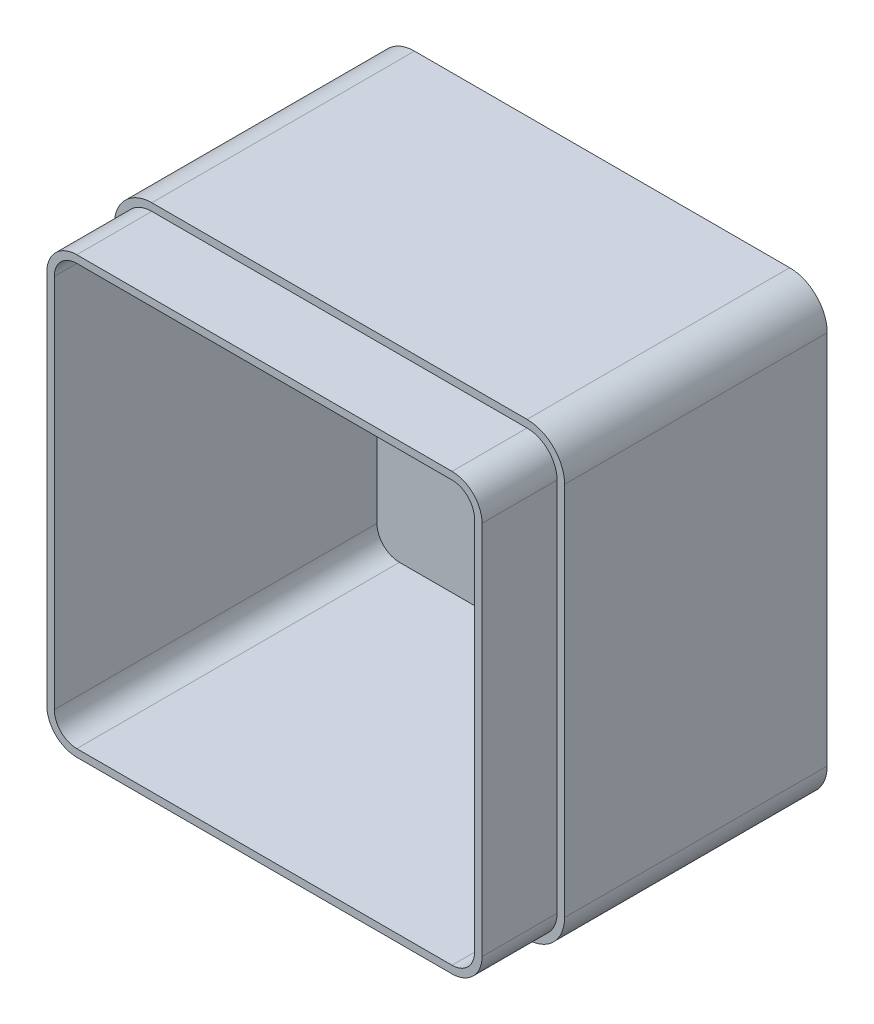
ISO-10303-21;
HEADER;
FILE_DESCRIPTION(('STEP AP214'),'2;1');
FILE_NAME('part.step','',(''),(''),'','','');
FILE_SCHEMA(('AUTOMOTIVE_DESIGN { 1 0 10303 214 1 1 1 1 }'));
ENDSEC;
DATA;
#1=APPLICATION_CONTEXT('core data for automotive mechanical design processes');
#2=APPLICATION_PROTOCOL_DEFINITION('international standard','automotive_design',2000,#1);
#3=PRODUCT_CONTEXT('',#1,'mechanical');
#4=PRODUCT('Part','Part','',(#3));
#5=PRODUCT_RELATED_PRODUCT_CATEGORY('part','',(#4));
#6=PRODUCT_DEFINITION_FORMATION('','',#4);
#7=PRODUCT_DEFINITION_CONTEXT('part definition',#1,'design');
#8=PRODUCT_DEFINITION('design','',#6,#7);
#9=PRODUCT_DEFINITION_SHAPE('','',#8);
#10=(LENGTH_UNIT() NAMED_UNIT(*) SI_UNIT(.MILLI.,.METRE.));
#11=(NAMED_UNIT(*) PLANE_ANGLE_UNIT() SI_UNIT($,.RADIAN.));
#12=(NAMED_UNIT(*) SI_UNIT($,.STERADIAN.) SOLID_ANGLE_UNIT());
#13=UNCERTAINTY_MEASURE_WITH_UNIT(LENGTH_MEASURE(1.E-05),#10,'distance_accuracy_value','');
#14=(GEOMETRIC_REPRESENTATION_CONTEXT(3) GLOBAL_UNCERTAINTY_ASSIGNED_CONTEXT((#13)) GLOBAL_UNIT_ASSIGNED_CONTEXT((#10,
#11,#12)) REPRESENTATION_CONTEXT('',''));
#15=CARTESIAN_POINT('',(0.,0.,0.));
#16=DIRECTION('',(0.,0.,1.));
#17=DIRECTION('',(1.,0.,0.));
#18=AXIS2_PLACEMENT_3D('',#15,#16,#17);
#19=CARTESIAN_POINT('',(0.,0.,90.));
#20=DIRECTION('',(0.,0.,1.));
#21=DIRECTION('',(1.,0.,0.));
#22=AXIS2_PLACEMENT_3D('',#19,#20,#21);
#23=PLANE('',#22);
#24=DIRECTION('',(1.,0.,0.));
#25=VECTOR('',#24,1.);
#26=CARTESIAN_POINT('',(0.,4.,90.));
#27=LINE('',#26,#25);
#28=CARTESIAN_POINT('',(9.99999999999999,4.,90.));
#29=VERTEX_POINT('',#28);
#30=CARTESIAN_POINT('',(110.,4.,90.));
#31=VERTEX_POINT('',#30);
#32=EDGE_CURVE('E392',#29,#31,#27,.T.);
#33=ORIENTED_EDGE('',*,*,#32,.F.);
#34=CARTESIAN_POINT('',(9.99999999999999,10.,90.));
#35=DIRECTION('',(0.,0.,1.));
#36=DIRECTION('',(1.,0.,0.));
#37=AXIS2_PLACEMENT_3D('',#34,#35,#36);
#38=CIRCLE('',#37,6.);
#39=CARTESIAN_POINT('',(4.,10.,90.));
#40=VERTEX_POINT('',#39);
#41=EDGE_CURVE('E393',#40,#29,#38,.T.);
#42=ORIENTED_EDGE('',*,*,#41,.F.);
#43=DIRECTION('',(0.,1.,0.));
#44=VECTOR('',#43,1.);
#45=CARTESIAN_POINT('',(4.,0.,90.));
#46=LINE('',#45,#44);
#47=CARTESIAN_POINT('',(3.99999999999996,110.,90.));
#48=VERTEX_POINT('',#47);
#49=EDGE_CURVE('E381',#40,#48,#46,.T.);
#50=ORIENTED_EDGE('',*,*,#49,.T.);
#51=CARTESIAN_POINT('',(9.99999999999996,110.,90.));
#52=DIRECTION('',(0.,0.,1.));
#53=DIRECTION('',(1.,0.,0.));
#54=AXIS2_PLACEMENT_3D('',#51,#52,#53);
#55=CIRCLE('',#54,6.);
#56=CARTESIAN_POINT('',(9.99999999999996,116.,90.));
#57=VERTEX_POINT('',#56);
#58=EDGE_CURVE('E374',#57,#48,#55,.T.);
#59=ORIENTED_EDGE('',*,*,#58,.F.);
#60=DIRECTION('',(1.,0.,0.));
#61=VECTOR('',#60,1.);
#62=CARTESIAN_POINT('',(0.,116.,90.));
#63=LINE('',#62,#61);
#64=CARTESIAN_POINT('',(110.,116.,90.));
#65=VERTEX_POINT('',#64);
#66=EDGE_CURVE('E353',#57,#65,#63,.T.);
#67=ORIENTED_EDGE('',*,*,#66,.T.);
#68=CARTESIAN_POINT('',(110.,110.,90.));
#69=DIRECTION('',(0.,0.,1.));
#70=DIRECTION('',(1.,0.,0.));
#71=AXIS2_PLACEMENT_3D('',#68,#69,#70);
#72=CIRCLE('',#71,6.);
#73=CARTESIAN_POINT('',(116.,110.,90.));
#74=VERTEX_POINT('',#73);
#75=EDGE_CURVE('E388',#74,#65,#72,.T.);
#76=ORIENTED_EDGE('',*,*,#75,.F.);
#77=DIRECTION('',(0.,1.,0.));
#78=VECTOR('',#77,1.);
#79=CARTESIAN_POINT('',(116.,0.,90.));
#80=LINE('',#79,#78);
#81=CARTESIAN_POINT('',(116.,10.,90.));
#82=VERTEX_POINT('',#81);
#83=EDGE_CURVE('E385',#82,#74,#80,.T.);
#84=ORIENTED_EDGE('',*,*,#83,.F.);
#85=CARTESIAN_POINT('',(110.,10.,90.));
#86=DIRECTION('',(0.,0.,1.));
#87=DIRECTION('',(1.,0.,0.));
#88=AXIS2_PLACEMENT_3D('',#85,#86,#87);
#89=CIRCLE('',#88,6.);
#90=EDGE_CURVE('E367',#31,#82,#89,.T.);
#91=ORIENTED_EDGE('',*,*,#90,.F.);
#92=EDGE_LOOP('',(#33,#42,#50,#59,#67,#76,#84,#91));
#93=FACE_BOUND('',#92,.T.);
#94=DIRECTION('',(0.,1.,0.));
#95=VECTOR('',#94,1.);
#96=CARTESIAN_POINT('',(118.,9.99999999999999,90.));
#97=LINE('',#96,#95);
#98=CARTESIAN_POINT('',(118.,10.,90.));
#99=VERTEX_POINT('',#98);
#100=CARTESIAN_POINT('',(118.,110.,90.));
#101=VERTEX_POINT('',#100);
#102=EDGE_CURVE('E229',#99,#101,#97,.T.);
#103=ORIENTED_EDGE('',*,*,#102,.T.);
#104=CARTESIAN_POINT('',(110.,110.,90.));
#105=DIRECTION('',(0.,0.,1.));
#106=DIRECTION('',(1.,0.,0.));
#107=AXIS2_PLACEMENT_3D('',#104,#105,#106);
#108=CIRCLE('',#107,8.00000000000001);
#109=CARTESIAN_POINT('',(110.,118.,90.));
#110=VERTEX_POINT('',#109);
#111=EDGE_CURVE('E256',#101,#110,#108,.T.);
#112=ORIENTED_EDGE('',*,*,#111,.T.);
#113=DIRECTION('',(-1.,0.,0.));
#114=VECTOR('',#113,1.);
#115=CARTESIAN_POINT('',(110.,118.,90.));
#116=LINE('',#115,#114);
#117=CARTESIAN_POINT('',(9.99999999999995,118.,90.));
#118=VERTEX_POINT('',#117);
#119=EDGE_CURVE('E206',#110,#118,#116,.T.);
#120=ORIENTED_EDGE('',*,*,#119,.T.);
#121=CARTESIAN_POINT('',(9.99999999999996,110.,90.));
#122=DIRECTION('',(0.,0.,1.));
#123=DIRECTION('',(1.,0.,0.));
#124=AXIS2_PLACEMENT_3D('',#121,#122,#123);
#125=CIRCLE('',#124,7.99999999999999);
#126=CARTESIAN_POINT('',(1.99999999999997,110.,90.));
#127=VERTEX_POINT('',#126);
#128=EDGE_CURVE('E55',#118,#127,#125,.T.);
#129=ORIENTED_EDGE('',*,*,#128,.T.);
#130=DIRECTION('',(0.,-1.,0.));
#131=VECTOR('',#130,1.);
#132=CARTESIAN_POINT('',(1.99999999999996,110.,90.));
#133=LINE('',#132,#131);
#134=CARTESIAN_POINT('',(1.99999999999996,9.99999999999999,90.));
#135=VERTEX_POINT('',#134);
#136=EDGE_CURVE('E263',#127,#135,#133,.T.);
#137=ORIENTED_EDGE('',*,*,#136,.T.);
#138=CARTESIAN_POINT('',(9.99999999999999,10.,90.));
#139=DIRECTION('',(0.,0.,1.));
#140=DIRECTION('',(1.,0.,0.));
#141=AXIS2_PLACEMENT_3D('',#138,#139,#140);
#142=CIRCLE('',#141,8.00000000000001);
#143=CARTESIAN_POINT('',(9.99999999999999,1.99999999999998,90.));
#144=VERTEX_POINT('',#143);
#145=EDGE_CURVE('E267',#135,#144,#142,.T.);
#146=ORIENTED_EDGE('',*,*,#145,.T.);
#147=DIRECTION('',(1.,0.,0.));
#148=VECTOR('',#147,1.);
#149=CARTESIAN_POINT('',(9.99999999999999,2.,90.));
#150=LINE('',#149,#148);
#151=CARTESIAN_POINT('',(110.,2.,90.));
#152=VERTEX_POINT('',#151);
#153=EDGE_CURVE('E271',#144,#152,#150,.T.);
#154=ORIENTED_EDGE('',*,*,#153,.T.);
#155=CARTESIAN_POINT('',(110.,10.,90.));
#156=DIRECTION('',(0.,0.,1.));
#157=DIRECTION('',(1.,0.,0.));
#158=AXIS2_PLACEMENT_3D('',#155,#156,#157);
#159=CIRCLE('',#158,7.99999999999999);
#160=EDGE_CURVE('E233',#152,#99,#159,.T.);
#161=ORIENTED_EDGE('',*,*,#160,.T.);
#162=EDGE_LOOP('',(#103,#112,#120,#129,#137,#146,#154,#161));
#163=FACE_BOUND('',#162,.T.);
#164=ADVANCED_FACE('F39',(#93,#163),#23,.T.);
#165=CARTESIAN_POINT('',(0.,116.,90.));
#166=DIRECTION('',(0.,1.,0.));
#167=DIRECTION('',(0.,0.,1.));
#168=AXIS2_PLACEMENT_3D('',#165,#166,#167);
#169=PLANE('',#168);
#170=ORIENTED_EDGE('',*,*,#66,.F.);
#171=DIRECTION('',(0.,0.,1.));
#172=VECTOR('',#171,1.);
#173=CARTESIAN_POINT('',(9.99999999999996,116.,90.));
#174=LINE('',#173,#172);
#175=CARTESIAN_POINT('',(9.99999999999996,116.,4.));
#176=VERTEX_POINT('',#175);
#177=EDGE_CURVE('E326',#176,#57,#174,.T.);
#178=ORIENTED_EDGE('',*,*,#177,.F.);
#179=DIRECTION('',(1.,0.,0.));
#180=VECTOR('',#179,1.);
#181=CARTESIAN_POINT('',(0.,116.,4.));
#182=LINE('',#181,#180);
#183=CARTESIAN_POINT('',(110.,116.,4.));
#184=VERTEX_POINT('',#183);
#185=EDGE_CURVE('E320',#176,#184,#182,.T.);
#186=ORIENTED_EDGE('',*,*,#185,.T.);
#187=DIRECTION('',(0.,0.,1.));
#188=VECTOR('',#187,1.);
#189=CARTESIAN_POINT('',(110.,116.,90.));
#190=LINE('',#189,#188);
#191=EDGE_CURVE('E321',#65,#184,#190,.F.);
#192=ORIENTED_EDGE('',*,*,#191,.F.);
#193=EDGE_LOOP('',(#170,#178,#186,#192));
#194=FACE_BOUND('',#193,.T.);
#195=ADVANCED_FACE('F505',(#194),#169,.F.);
#196=CARTESIAN_POINT('',(4.,0.,90.));
#197=DIRECTION('',(-1.,0.,0.));
#198=DIRECTION('',(0.,-1.,0.));
#199=AXIS2_PLACEMENT_3D('',#196,#197,#198);
#200=PLANE('',#199);
#201=DIRECTION('',(0.,1.,0.));
#202=VECTOR('',#201,1.);
#203=CARTESIAN_POINT('',(4.,0.,4.));
#204=LINE('',#203,#202);
#205=CARTESIAN_POINT('',(4.,10.,4.));
#206=VERTEX_POINT('',#205);
#207=CARTESIAN_POINT('',(3.99999999999996,110.,4.));
#208=VERTEX_POINT('',#207);
#209=EDGE_CURVE('E346',#206,#208,#204,.T.);
#210=ORIENTED_EDGE('',*,*,#209,.T.);
#211=DIRECTION('',(0.,0.,1.));
#212=VECTOR('',#211,1.);
#213=CARTESIAN_POINT('',(3.99999999999996,110.,90.));
#214=LINE('',#213,#212);
#215=EDGE_CURVE('E363',#48,#208,#214,.F.);
#216=ORIENTED_EDGE('',*,*,#215,.F.);
#217=ORIENTED_EDGE('',*,*,#49,.F.);
#218=DIRECTION('',(0.,0.,1.));
#219=VECTOR('',#218,1.);
#220=CARTESIAN_POINT('',(4.,10.,90.));
#221=LINE('',#220,#219);
#222=EDGE_CURVE('E333',#206,#40,#221,.T.);
#223=ORIENTED_EDGE('',*,*,#222,.F.);
#224=EDGE_LOOP('',(#210,#216,#217,#223));
#225=FACE_BOUND('',#224,.T.);
#226=ADVANCED_FACE('F510',(#225),#200,.F.);
#227=CARTESIAN_POINT('',(0.,4.,90.));
#228=DIRECTION('',(0.,1.,0.));
#229=DIRECTION('',(0.,0.,1.));
#230=AXIS2_PLACEMENT_3D('',#227,#228,#229);
#231=PLANE('',#230);
#232=DIRECTION('',(1.,0.,0.));
#233=VECTOR('',#232,1.);
#234=CARTESIAN_POINT('',(0.,4.,4.));
#235=LINE('',#234,#233);
#236=CARTESIAN_POINT('',(9.99999999999999,4.,4.));
#237=VERTEX_POINT('',#236);
#238=CARTESIAN_POINT('',(110.,4.,4.));
#239=VERTEX_POINT('',#238);
#240=EDGE_CURVE('E337',#237,#239,#235,.T.);
#241=ORIENTED_EDGE('',*,*,#240,.F.);
#242=DIRECTION('',(0.,0.,1.));
#243=VECTOR('',#242,1.);
#244=CARTESIAN_POINT('',(9.99999999999999,4.,90.));
#245=LINE('',#244,#243);
#246=EDGE_CURVE('E341',#29,#237,#245,.F.);
#247=ORIENTED_EDGE('',*,*,#246,.F.);
#248=ORIENTED_EDGE('',*,*,#32,.T.);
#249=DIRECTION('',(0.,0.,1.));
#250=VECTOR('',#249,1.);
#251=CARTESIAN_POINT('',(110.,4.,90.));
#252=LINE('',#251,#250);
#253=EDGE_CURVE('E371',#239,#31,#252,.T.);
#254=ORIENTED_EDGE('',*,*,#253,.F.);
#255=EDGE_LOOP('',(#241,#247,#248,#254));
#256=FACE_BOUND('',#255,.T.);
#257=ADVANCED_FACE('F539',(#256),#231,.T.);
#258=CARTESIAN_POINT('',(116.,0.,90.));
#259=DIRECTION('',(-1.,0.,0.));
#260=DIRECTION('',(0.,-1.,0.));
#261=AXIS2_PLACEMENT_3D('',#258,#259,#260);
#262=PLANE('',#261);
#263=ORIENTED_EDGE('',*,*,#83,.T.);
#264=DIRECTION('',(0.,0.,1.));
#265=VECTOR('',#264,1.);
#266=CARTESIAN_POINT('',(116.,110.,90.));
#267=LINE('',#266,#265);
#268=CARTESIAN_POINT('',(116.,110.,4.));
#269=VERTEX_POINT('',#268);
#270=EDGE_CURVE('E378',#269,#74,#267,.T.);
#271=ORIENTED_EDGE('',*,*,#270,.F.);
#272=DIRECTION('',(0.,1.,0.));
#273=VECTOR('',#272,1.);
#274=CARTESIAN_POINT('',(116.,0.,4.));
#275=LINE('',#274,#273);
#276=CARTESIAN_POINT('',(116.,10.,4.));
#277=VERTEX_POINT('',#276);
#278=EDGE_CURVE('E330',#277,#269,#275,.T.);
#279=ORIENTED_EDGE('',*,*,#278,.F.);
#280=DIRECTION('',(0.,0.,1.));
#281=VECTOR('',#280,1.);
#282=CARTESIAN_POINT('',(116.,10.,90.));
#283=LINE('',#282,#281);
#284=EDGE_CURVE('E357',#82,#277,#283,.F.);
#285=ORIENTED_EDGE('',*,*,#284,.F.);
#286=EDGE_LOOP('',(#263,#271,#279,#285));
#287=FACE_BOUND('',#286,.T.);
#288=ADVANCED_FACE('F535',(#287),#262,.T.);
#289=CARTESIAN_POINT('',(0.,0.,4.));
#290=DIRECTION('',(0.,0.,1.));
#291=DIRECTION('',(1.,0.,0.));
#292=AXIS2_PLACEMENT_3D('',#289,#290,#291);
#293=PLANE('',#292);
#294=ORIENTED_EDGE('',*,*,#278,.T.);
#295=CARTESIAN_POINT('',(110.,110.,4.));
#296=DIRECTION('',(0.,0.,1.));
#297=DIRECTION('',(1.,0.,0.));
#298=AXIS2_PLACEMENT_3D('',#295,#296,#297);
#299=CIRCLE('',#298,6.);
#300=EDGE_CURVE('E349',#184,#269,#299,.F.);
#301=ORIENTED_EDGE('',*,*,#300,.F.);
#302=ORIENTED_EDGE('',*,*,#185,.F.);
#303=CARTESIAN_POINT('',(9.99999999999996,110.,4.));
#304=DIRECTION('',(0.,0.,1.));
#305=DIRECTION('',(1.,0.,0.));
#306=AXIS2_PLACEMENT_3D('',#303,#304,#305);
#307=CIRCLE('',#306,6.);
#308=EDGE_CURVE('E354',#208,#176,#307,.F.);
#309=ORIENTED_EDGE('',*,*,#308,.F.);
#310=ORIENTED_EDGE('',*,*,#209,.F.);
#311=CARTESIAN_POINT('',(9.99999999999999,10.,4.));
#312=DIRECTION('',(0.,0.,1.));
#313=DIRECTION('',(1.,0.,0.));
#314=AXIS2_PLACEMENT_3D('',#311,#312,#313);
#315=CIRCLE('',#314,6.);
#316=EDGE_CURVE('E342',#237,#206,#315,.F.);
#317=ORIENTED_EDGE('',*,*,#316,.F.);
#318=ORIENTED_EDGE('',*,*,#240,.T.);
#319=CARTESIAN_POINT('',(110.,10.,4.));
#320=DIRECTION('',(0.,0.,1.));
#321=DIRECTION('',(1.,0.,0.));
#322=AXIS2_PLACEMENT_3D('',#319,#320,#321);
#323=CIRCLE('',#322,6.);
#324=EDGE_CURVE('E338',#277,#239,#323,.F.);
#325=ORIENTED_EDGE('',*,*,#324,.F.);
#326=EDGE_LOOP('',(#294,#301,#302,#309,#310,#317,#318,#325));
#327=FACE_BOUND('',#326,.T.);
#328=ADVANCED_FACE('F531',(#327),#293,.T.);
#329=CARTESIAN_POINT('',(110.,10.,90.));
#330=DIRECTION('',(0.,0.,-1.));
#331=DIRECTION('',(-1.,0.,0.));
#332=AXIS2_PLACEMENT_3D('',#329,#330,#331);
#333=CYLINDRICAL_SURFACE('',#332,6.);
#334=ORIENTED_EDGE('',*,*,#90,.T.);
#335=ORIENTED_EDGE('',*,*,#284,.T.);
#336=ORIENTED_EDGE('',*,*,#324,.T.);
#337=ORIENTED_EDGE('',*,*,#253,.T.);
#338=EDGE_LOOP('',(#334,#335,#336,#337));
#339=FACE_BOUND('',#338,.T.);
#340=ADVANCED_FACE('F527',(#339),#333,.F.);
#341=CARTESIAN_POINT('',(9.99999999999999,10.,90.));
#342=DIRECTION('',(0.,0.,1.));
#343=DIRECTION('',(1.,0.,0.));
#344=AXIS2_PLACEMENT_3D('',#341,#342,#343);
#345=CYLINDRICAL_SURFACE('',#344,6.);
#346=ORIENTED_EDGE('',*,*,#41,.T.);
#347=ORIENTED_EDGE('',*,*,#246,.T.);
#348=ORIENTED_EDGE('',*,*,#316,.T.);
#349=ORIENTED_EDGE('',*,*,#222,.T.);
#350=EDGE_LOOP('',(#346,#347,#348,#349));
#351=FACE_BOUND('',#350,.T.);
#352=ADVANCED_FACE('F523',(#351),#345,.F.);
#353=CARTESIAN_POINT('',(110.,110.,90.));
#354=DIRECTION('',(0.,0.,1.));
#355=DIRECTION('',(1.,0.,0.));
#356=AXIS2_PLACEMENT_3D('',#353,#354,#355);
#357=CYLINDRICAL_SURFACE('',#356,6.);
#358=ORIENTED_EDGE('',*,*,#75,.T.);
#359=ORIENTED_EDGE('',*,*,#191,.T.);
#360=ORIENTED_EDGE('',*,*,#300,.T.);
#361=ORIENTED_EDGE('',*,*,#270,.T.);
#362=EDGE_LOOP('',(#358,#359,#360,#361));
#363=FACE_BOUND('',#362,.T.);
#364=ADVANCED_FACE('F519',(#363),#357,.F.);
#365=CARTESIAN_POINT('',(9.99999999999996,110.,90.));
#366=DIRECTION('',(0.,0.,-1.));
#367=DIRECTION('',(-1.,0.,0.));
#368=AXIS2_PLACEMENT_3D('',#365,#366,#367);
#369=CYLINDRICAL_SURFACE('',#368,6.);
#370=ORIENTED_EDGE('',*,*,#58,.T.);
#371=ORIENTED_EDGE('',*,*,#215,.T.);
#372=ORIENTED_EDGE('',*,*,#308,.T.);
#373=ORIENTED_EDGE('',*,*,#177,.T.);
#374=EDGE_LOOP('',(#370,#371,#372,#373));
#375=FACE_BOUND('',#374,.T.);
#376=ADVANCED_FACE('F516',(#375),#369,.F.);
#377=CARTESIAN_POINT('',(9.99999999999999,10.,70.));
#378=DIRECTION('',(0.,0.,1.));
#379=DIRECTION('',(1.,0.,0.));
#380=AXIS2_PLACEMENT_3D('',#377,#378,#379);
#381=PLANE('',#380);
#382=DIRECTION('',(0.,1.,0.));
#383=VECTOR('',#382,1.);
#384=CARTESIAN_POINT('',(118.,9.99999999999999,70.));
#385=LINE('',#384,#383);
#386=CARTESIAN_POINT('',(118.,10.,70.));
#387=VERTEX_POINT('',#386);
#388=CARTESIAN_POINT('',(118.,110.,70.));
#389=VERTEX_POINT('',#388);
#390=EDGE_CURVE('E213',#387,#389,#385,.T.);
#391=ORIENTED_EDGE('',*,*,#390,.F.);
#392=CARTESIAN_POINT('',(110.,10.,70.));
#393=DIRECTION('',(0.,0.,1.));
#394=DIRECTION('',(1.,0.,0.));
#395=AXIS2_PLACEMENT_3D('',#392,#393,#394);
#396=CIRCLE('',#395,7.99999999999999);
#397=CARTESIAN_POINT('',(110.,2.,70.));
#398=VERTEX_POINT('',#397);
#399=EDGE_CURVE('E250',#398,#387,#396,.T.);
#400=ORIENTED_EDGE('',*,*,#399,.F.);
#401=DIRECTION('',(1.,0.,0.));
#402=VECTOR('',#401,1.);
#403=CARTESIAN_POINT('',(9.99999999999999,2.,70.));
#404=LINE('',#403,#402);
#405=CARTESIAN_POINT('',(9.99999999999999,1.99999999999998,70.));
#406=VERTEX_POINT('',#405);
#407=EDGE_CURVE('E246',#406,#398,#404,.T.);
#408=ORIENTED_EDGE('',*,*,#407,.F.);
#409=CARTESIAN_POINT('',(9.99999999999999,10.,70.));
#410=DIRECTION('',(0.,0.,1.));
#411=DIRECTION('',(1.,0.,0.));
#412=AXIS2_PLACEMENT_3D('',#409,#410,#411);
#413=CIRCLE('',#412,8.00000000000001);
#414=CARTESIAN_POINT('',(1.99999999999996,9.99999999999999,70.));
#415=VERTEX_POINT('',#414);
#416=EDGE_CURVE('E242',#415,#406,#413,.T.);
#417=ORIENTED_EDGE('',*,*,#416,.F.);
#418=DIRECTION('',(0.,-1.,0.));
#419=VECTOR('',#418,1.);
#420=CARTESIAN_POINT('',(1.99999999999996,110.,70.));
#421=LINE('',#420,#419);
#422=CARTESIAN_POINT('',(1.99999999999997,110.,70.));
#423=VERTEX_POINT('',#422);
#424=EDGE_CURVE('E238',#423,#415,#421,.T.);
#425=ORIENTED_EDGE('',*,*,#424,.F.);
#426=CARTESIAN_POINT('',(9.99999999999996,110.,70.));
#427=DIRECTION('',(0.,0.,1.));
#428=DIRECTION('',(1.,0.,0.));
#429=AXIS2_PLACEMENT_3D('',#426,#427,#428);
#430=CIRCLE('',#429,7.99999999999999);
#431=CARTESIAN_POINT('',(9.99999999999995,118.,70.));
#432=VERTEX_POINT('',#431);
#433=EDGE_CURVE('E223',#432,#423,#430,.T.);
#434=ORIENTED_EDGE('',*,*,#433,.F.);
#435=DIRECTION('',(-1.,0.,0.));
#436=VECTOR('',#435,1.);
#437=CARTESIAN_POINT('',(110.,118.,70.));
#438=LINE('',#437,#436);
#439=CARTESIAN_POINT('',(110.,118.,70.));
#440=VERTEX_POINT('',#439);
#441=EDGE_CURVE('E204',#440,#432,#438,.T.);
#442=ORIENTED_EDGE('',*,*,#441,.F.);
#443=CARTESIAN_POINT('',(110.,110.,70.));
#444=DIRECTION('',(0.,0.,1.));
#445=DIRECTION('',(1.,0.,0.));
#446=AXIS2_PLACEMENT_3D('',#443,#444,#445);
#447=CIRCLE('',#446,8.00000000000001);
#448=EDGE_CURVE('E219',#389,#440,#447,.T.);
#449=ORIENTED_EDGE('',*,*,#448,.F.);
#450=EDGE_LOOP('',(#391,#400,#408,#417,#425,#434,#442,#449));
#451=FACE_BOUND('',#450,.T.);
#452=CARTESIAN_POINT('',(9.99999999999999,10.,70.));
#453=DIRECTION('',(0.,0.,1.));
#454=DIRECTION('',(1.,0.,0.));
#455=AXIS2_PLACEMENT_3D('',#452,#453,#454);
#456=CIRCLE('',#455,10.);
#457=CARTESIAN_POINT('',(0.,9.99999999999999,70.));
#458=VERTEX_POINT('',#457);
#459=CARTESIAN_POINT('',(9.99999999999999,0.,70.));
#460=VERTEX_POINT('',#459);
#461=EDGE_CURVE('E280',#458,#460,#456,.T.);
#462=ORIENTED_EDGE('',*,*,#461,.T.);
#463=DIRECTION('',(1.,0.,0.));
#464=VECTOR('',#463,1.);
#465=CARTESIAN_POINT('',(9.99999999999999,0.,70.));
#466=LINE('',#465,#464);
#467=CARTESIAN_POINT('',(110.,0.,70.));
#468=VERTEX_POINT('',#467);
#469=EDGE_CURVE('E300',#460,#468,#466,.T.);
#470=ORIENTED_EDGE('',*,*,#469,.T.);
#471=CARTESIAN_POINT('',(110.,10.,70.));
#472=DIRECTION('',(0.,0.,1.));
#473=DIRECTION('',(1.,0.,0.));
#474=AXIS2_PLACEMENT_3D('',#471,#472,#473);
#475=CIRCLE('',#474,9.99999999999999);
#476=CARTESIAN_POINT('',(120.,10.,70.));
#477=VERTEX_POINT('',#476);
#478=EDGE_CURVE('E303',#468,#477,#475,.T.);
#479=ORIENTED_EDGE('',*,*,#478,.T.);
#480=DIRECTION('',(0.,1.,0.));
#481=VECTOR('',#480,1.);
#482=CARTESIAN_POINT('',(120.,10.,70.));
#483=LINE('',#482,#481);
#484=CARTESIAN_POINT('',(120.,110.,70.));
#485=VERTEX_POINT('',#484);
#486=EDGE_CURVE('E306',#477,#485,#483,.T.);
#487=ORIENTED_EDGE('',*,*,#486,.T.);
#488=CARTESIAN_POINT('',(110.,110.,70.));
#489=DIRECTION('',(0.,0.,1.));
#490=DIRECTION('',(1.,0.,0.));
#491=AXIS2_PLACEMENT_3D('',#488,#489,#490);
#492=CIRCLE('',#491,9.99999999999999);
#493=CARTESIAN_POINT('',(110.,120.,70.));
#494=VERTEX_POINT('',#493);
#495=EDGE_CURVE('E309',#485,#494,#492,.T.);
#496=ORIENTED_EDGE('',*,*,#495,.T.);
#497=DIRECTION('',(-1.,0.,0.));
#498=VECTOR('',#497,1.);
#499=CARTESIAN_POINT('',(110.,120.,70.));
#500=LINE('',#499,#498);
#501=CARTESIAN_POINT('',(9.99999999999996,120.,70.));
#502=VERTEX_POINT('',#501);
#503=EDGE_CURVE('E63',#494,#502,#500,.T.);
#504=ORIENTED_EDGE('',*,*,#503,.T.);
#505=CARTESIAN_POINT('',(9.99999999999996,110.,70.));
#506=DIRECTION('',(0.,0.,1.));
#507=DIRECTION('',(1.,0.,0.));
#508=AXIS2_PLACEMENT_3D('',#505,#506,#507);
#509=CIRCLE('',#508,9.99999999999999);
#510=CARTESIAN_POINT('',(0.,110.,70.));
#511=VERTEX_POINT('',#510);
#512=EDGE_CURVE('E314',#502,#511,#509,.T.);
#513=ORIENTED_EDGE('',*,*,#512,.T.);
#514=DIRECTION('',(0.,-1.,0.));
#515=VECTOR('',#514,1.);
#516=CARTESIAN_POINT('',(0.,110.,70.));
#517=LINE('',#516,#515);
#518=EDGE_CURVE('E317',#511,#458,#517,.T.);
#519=ORIENTED_EDGE('',*,*,#518,.T.);
#520=EDGE_LOOP('',(#462,#470,#479,#487,#496,#504,#513,#519));
#521=FACE_BOUND('',#520,.T.);
#522=ADVANCED_FACE('F218',(#451,#521),#381,.T.);
#523=CARTESIAN_POINT('',(110.,110.,70.));
#524=DIRECTION('',(0.,0.,1.));
#525=DIRECTION('',(1.,0.,0.));
#526=AXIS2_PLACEMENT_3D('',#523,#524,#525);
#527=CYLINDRICAL_SURFACE('',#526,8.00000000000001);
#528=ORIENTED_EDGE('',*,*,#111,.F.);
#529=DIRECTION('',(0.,0.,1.));
#530=VECTOR('',#529,1.);
#531=CARTESIAN_POINT('',(118.,110.,70.));
#532=LINE('',#531,#530);
#533=EDGE_CURVE('E227',#389,#101,#532,.T.);
#534=ORIENTED_EDGE('',*,*,#533,.F.);
#535=ORIENTED_EDGE('',*,*,#448,.T.);
#536=DIRECTION('',(0.,0.,1.));
#537=VECTOR('',#536,1.);
#538=CARTESIAN_POINT('',(110.,118.,70.));
#539=LINE('',#538,#537);
#540=EDGE_CURVE('E201',#440,#110,#539,.T.);
#541=ORIENTED_EDGE('',*,*,#540,.T.);
#542=EDGE_LOOP('',(#528,#534,#535,#541));
#543=FACE_BOUND('',#542,.T.);
#544=ADVANCED_FACE('F226',(#543),#527,.T.);
#545=CARTESIAN_POINT('',(118.,9.99999999999999,70.));
#546=DIRECTION('',(1.,0.,0.));
#547=DIRECTION('',(0.,0.,-1.));
#548=AXIS2_PLACEMENT_3D('',#545,#546,#547);
#549=PLANE('',#548);
#550=ORIENTED_EDGE('',*,*,#102,.F.);
#551=DIRECTION('',(0.,0.,1.));
#552=VECTOR('',#551,1.);
#553=CARTESIAN_POINT('',(118.,10.,70.));
#554=LINE('',#553,#552);
#555=EDGE_CURVE('E281',#387,#99,#554,.T.);
#556=ORIENTED_EDGE('',*,*,#555,.F.);
#557=ORIENTED_EDGE('',*,*,#390,.T.);
#558=ORIENTED_EDGE('',*,*,#533,.T.);
#559=EDGE_LOOP('',(#550,#556,#557,#558));
#560=FACE_BOUND('',#559,.T.);
#561=ADVANCED_FACE('F550',(#560),#549,.T.);
#562=CARTESIAN_POINT('',(110.,10.,70.));
#563=DIRECTION('',(0.,0.,1.));
#564=DIRECTION('',(1.,0.,0.));
#565=AXIS2_PLACEMENT_3D('',#562,#563,#564);
#566=CYLINDRICAL_SURFACE('',#565,7.99999999999999);
#567=ORIENTED_EDGE('',*,*,#160,.F.);
#568=DIRECTION('',(0.,0.,1.));
#569=VECTOR('',#568,1.);
#570=CARTESIAN_POINT('',(110.,2.,70.));
#571=LINE('',#570,#569);
#572=EDGE_CURVE('E284',#398,#152,#571,.T.);
#573=ORIENTED_EDGE('',*,*,#572,.F.);
#574=ORIENTED_EDGE('',*,*,#399,.T.);
#575=ORIENTED_EDGE('',*,*,#555,.T.);
#576=EDGE_LOOP('',(#567,#573,#574,#575));
#577=FACE_BOUND('',#576,.T.);
#578=ADVANCED_FACE('F565',(#577),#566,.T.);
#579=CARTESIAN_POINT('',(9.99999999999999,2.,70.));
#580=DIRECTION('',(0.,-1.,0.));
#581=DIRECTION('',(0.,0.,-1.));
#582=AXIS2_PLACEMENT_3D('',#579,#580,#581);
#583=PLANE('',#582);
#584=ORIENTED_EDGE('',*,*,#153,.F.);
#585=DIRECTION('',(0.,0.,1.));
#586=VECTOR('',#585,1.);
#587=CARTESIAN_POINT('',(9.99999999999999,1.99999999999998,70.));
#588=LINE('',#587,#586);
#589=EDGE_CURVE('E287',#406,#144,#588,.T.);
#590=ORIENTED_EDGE('',*,*,#589,.F.);
#591=ORIENTED_EDGE('',*,*,#407,.T.);
#592=ORIENTED_EDGE('',*,*,#572,.T.);
#593=EDGE_LOOP('',(#584,#590,#591,#592));
#594=FACE_BOUND('',#593,.T.);
#595=ADVANCED_FACE('F561',(#594),#583,.T.);
#596=CARTESIAN_POINT('',(9.99999999999999,10.,70.));
#597=DIRECTION('',(0.,0.,1.));
#598=DIRECTION('',(1.,0.,0.));
#599=AXIS2_PLACEMENT_3D('',#596,#597,#598);
#600=CYLINDRICAL_SURFACE('',#599,8.00000000000001);
#601=ORIENTED_EDGE('',*,*,#145,.F.);
#602=DIRECTION('',(0.,0.,1.));
#603=VECTOR('',#602,1.);
#604=CARTESIAN_POINT('',(1.99999999999996,9.99999999999999,70.));
#605=LINE('',#604,#603);
#606=EDGE_CURVE('E290',#415,#135,#605,.T.);
#607=ORIENTED_EDGE('',*,*,#606,.F.);
#608=ORIENTED_EDGE('',*,*,#416,.T.);
#609=ORIENTED_EDGE('',*,*,#589,.T.);
#610=EDGE_LOOP('',(#601,#607,#608,#609));
#611=FACE_BOUND('',#610,.T.);
#612=ADVANCED_FACE('F557',(#611),#600,.T.);
#613=CARTESIAN_POINT('',(1.99999999999996,110.,70.));
#614=DIRECTION('',(-1.,0.,0.));
#615=DIRECTION('',(0.,-1.,0.));
#616=AXIS2_PLACEMENT_3D('',#613,#614,#615);
#617=PLANE('',#616);
#618=ORIENTED_EDGE('',*,*,#136,.F.);
#619=DIRECTION('',(0.,0.,1.));
#620=VECTOR('',#619,1.);
#621=CARTESIAN_POINT('',(1.99999999999997,110.,70.));
#622=LINE('',#621,#620);
#623=EDGE_CURVE('E293',#423,#127,#622,.T.);
#624=ORIENTED_EDGE('',*,*,#623,.F.);
#625=ORIENTED_EDGE('',*,*,#424,.T.);
#626=ORIENTED_EDGE('',*,*,#606,.T.);
#627=EDGE_LOOP('',(#618,#624,#625,#626));
#628=FACE_BOUND('',#627,.T.);
#629=ADVANCED_FACE('F554',(#628),#617,.T.);
#630=CARTESIAN_POINT('',(9.99999999999996,110.,70.));
#631=DIRECTION('',(0.,0.,1.));
#632=DIRECTION('',(1.,0.,0.));
#633=AXIS2_PLACEMENT_3D('',#630,#631,#632);
#634=CYLINDRICAL_SURFACE('',#633,7.99999999999999);
#635=ORIENTED_EDGE('',*,*,#128,.F.);
#636=DIRECTION('',(0.,0.,1.));
#637=VECTOR('',#636,1.);
#638=CARTESIAN_POINT('',(9.99999999999995,118.,70.));
#639=LINE('',#638,#637);
#640=EDGE_CURVE('E212',#432,#118,#639,.T.);
#641=ORIENTED_EDGE('',*,*,#640,.F.);
#642=ORIENTED_EDGE('',*,*,#433,.T.);
#643=ORIENTED_EDGE('',*,*,#623,.T.);
#644=EDGE_LOOP('',(#635,#641,#642,#643));
#645=FACE_BOUND('',#644,.T.);
#646=ADVANCED_FACE('F500',(#645),#634,.T.);
#647=CARTESIAN_POINT('',(110.,118.,70.));
#648=DIRECTION('',(0.,1.,0.));
#649=DIRECTION('',(0.,0.,1.));
#650=AXIS2_PLACEMENT_3D('',#647,#648,#649);
#651=PLANE('',#650);
#652=ORIENTED_EDGE('',*,*,#119,.F.);
#653=ORIENTED_EDGE('',*,*,#540,.F.);
#654=ORIENTED_EDGE('',*,*,#441,.T.);
#655=ORIENTED_EDGE('',*,*,#640,.T.);
#656=EDGE_LOOP('',(#652,#653,#654,#655));
#657=FACE_BOUND('',#656,.T.);
#658=ADVANCED_FACE('F203',(#657),#651,.T.);
#659=CARTESIAN_POINT('',(0.,0.,0.));
#660=DIRECTION('',(0.,0.,1.));
#661=DIRECTION('',(1.,0.,0.));
#662=AXIS2_PLACEMENT_3D('',#659,#660,#661);
#663=PLANE('',#662);
#664=DIRECTION('',(0.,1.,0.));
#665=VECTOR('',#664,1.);
#666=CARTESIAN_POINT('',(120.,0.,0.));
#667=LINE('',#666,#665);
#668=CARTESIAN_POINT('',(120.,10.,0.));
#669=VERTEX_POINT('',#668);
#670=CARTESIAN_POINT('',(120.,110.,0.));
#671=VERTEX_POINT('',#670);
#672=EDGE_CURVE('E409',#669,#671,#667,.T.);
#673=ORIENTED_EDGE('',*,*,#672,.F.);
#674=CARTESIAN_POINT('',(110.,10.,0.));
#675=DIRECTION('',(0.,0.,1.));
#676=DIRECTION('',(1.,0.,0.));
#677=AXIS2_PLACEMENT_3D('',#674,#675,#676);
#678=CIRCLE('',#677,10.);
#679=CARTESIAN_POINT('',(110.,0.,0.));
#680=VERTEX_POINT('',#679);
#681=EDGE_CURVE('E437',#669,#680,#678,.F.);
#682=ORIENTED_EDGE('',*,*,#681,.T.);
#683=DIRECTION('',(1.,0.,0.));
#684=VECTOR('',#683,1.);
#685=CARTESIAN_POINT('',(0.,0.,0.));
#686=LINE('',#685,#684);
#687=CARTESIAN_POINT('',(9.99999999999999,0.,0.));
#688=VERTEX_POINT('',#687);
#689=EDGE_CURVE('E413',#688,#680,#686,.T.);
#690=ORIENTED_EDGE('',*,*,#689,.F.);
#691=CARTESIAN_POINT('',(9.99999999999999,10.,0.));
#692=DIRECTION('',(0.,0.,1.));
#693=DIRECTION('',(1.,0.,0.));
#694=AXIS2_PLACEMENT_3D('',#691,#692,#693);
#695=CIRCLE('',#694,10.);
#696=CARTESIAN_POINT('',(0.,9.99999999999999,0.));
#697=VERTEX_POINT('',#696);
#698=EDGE_CURVE('E434',#688,#697,#695,.F.);
#699=ORIENTED_EDGE('',*,*,#698,.T.);
#700=DIRECTION('',(0.,1.,0.));
#701=VECTOR('',#700,1.);
#702=CARTESIAN_POINT('',(0.,0.,0.));
#703=LINE('',#702,#701);
#704=CARTESIAN_POINT('',(0.,110.,0.));
#705=VERTEX_POINT('',#704);
#706=EDGE_CURVE('E417',#697,#705,#703,.T.);
#707=ORIENTED_EDGE('',*,*,#706,.T.);
#708=CARTESIAN_POINT('',(9.99999999999996,110.,0.));
#709=DIRECTION('',(0.,0.,1.));
#710=DIRECTION('',(1.,0.,0.));
#711=AXIS2_PLACEMENT_3D('',#708,#709,#710);
#712=CIRCLE('',#711,10.);
#713=CARTESIAN_POINT('',(9.99999999999996,120.,0.));
#714=VERTEX_POINT('',#713);
#715=EDGE_CURVE('E428',#705,#714,#712,.F.);
#716=ORIENTED_EDGE('',*,*,#715,.T.);
#717=DIRECTION('',(1.,0.,0.));
#718=VECTOR('',#717,1.);
#719=CARTESIAN_POINT('',(0.,120.,0.));
#720=LINE('',#719,#718);
#721=CARTESIAN_POINT('',(110.,120.,0.));
#722=VERTEX_POINT('',#721);
#723=EDGE_CURVE('E325',#714,#722,#720,.T.);
#724=ORIENTED_EDGE('',*,*,#723,.T.);
#725=CARTESIAN_POINT('',(110.,110.,0.));
#726=DIRECTION('',(0.,0.,1.));
#727=DIRECTION('',(1.,0.,0.));
#728=AXIS2_PLACEMENT_3D('',#725,#726,#727);
#729=CIRCLE('',#728,10.);
#730=EDGE_CURVE('E431',#722,#671,#729,.F.);
#731=ORIENTED_EDGE('',*,*,#730,.T.);
#732=EDGE_LOOP('',(#673,#682,#690,#699,#707,#716,#724,#731));
#733=FACE_BOUND('',#732,.T.);
#734=ADVANCED_FACE('F493',(#733),#663,.F.);
#735=CARTESIAN_POINT('',(9.99999999999996,110.,90.));
#736=DIRECTION('',(0.,0.,-1.));
#737=DIRECTION('',(-1.,0.,0.));
#738=AXIS2_PLACEMENT_3D('',#735,#736,#737);
#739=CYLINDRICAL_SURFACE('',#738,10.);
#740=DIRECTION('',(0.,0.,-1.));
#741=VECTOR('',#740,1.);
#742=CARTESIAN_POINT('',(0.,110.,90.));
#743=LINE('',#742,#741);
#744=EDGE_CURVE('E447',#511,#705,#743,.T.);
#745=ORIENTED_EDGE('',*,*,#744,.F.);
#746=ORIENTED_EDGE('',*,*,#512,.F.);
#747=DIRECTION('',(0.,0.,-1.));
#748=VECTOR('',#747,1.);
#749=CARTESIAN_POINT('',(9.99999999999996,120.,90.));
#750=LINE('',#749,#748);
#751=EDGE_CURVE('E48',#714,#502,#750,.F.);
#752=ORIENTED_EDGE('',*,*,#751,.F.);
#753=ORIENTED_EDGE('',*,*,#715,.F.);
#754=EDGE_LOOP('',(#745,#746,#752,#753));
#755=FACE_BOUND('',#754,.T.);
#756=ADVANCED_FACE('F41',(#755),#739,.T.);
#757=CARTESIAN_POINT('',(110.,110.,90.));
#758=DIRECTION('',(0.,0.,1.));
#759=DIRECTION('',(1.,0.,0.));
#760=AXIS2_PLACEMENT_3D('',#757,#758,#759);
#761=CYLINDRICAL_SURFACE('',#760,10.);
#762=DIRECTION('',(0.,0.,-1.));
#763=VECTOR('',#762,1.);
#764=CARTESIAN_POINT('',(110.,120.,0.));
#765=LINE('',#764,#763);
#766=EDGE_CURVE('E11',#494,#722,#765,.T.);
#767=ORIENTED_EDGE('',*,*,#766,.F.);
#768=ORIENTED_EDGE('',*,*,#495,.F.);
#769=DIRECTION('',(0.,0.,-1.));
#770=VECTOR('',#769,1.);
#771=CARTESIAN_POINT('',(120.,110.,90.));
#772=LINE('',#771,#770);
#773=EDGE_CURVE('E421',#671,#485,#772,.F.);
#774=ORIENTED_EDGE('',*,*,#773,.F.);
#775=ORIENTED_EDGE('',*,*,#730,.F.);
#776=EDGE_LOOP('',(#767,#768,#774,#775));
#777=FACE_BOUND('',#776,.T.);
#778=ADVANCED_FACE('F491',(#777),#761,.T.);
#779=CARTESIAN_POINT('',(110.,10.,90.));
#780=DIRECTION('',(0.,0.,-1.));
#781=DIRECTION('',(-1.,0.,0.));
#782=AXIS2_PLACEMENT_3D('',#779,#780,#781);
#783=CYLINDRICAL_SURFACE('',#782,10.);
#784=DIRECTION('',(0.,0.,-1.));
#785=VECTOR('',#784,1.);
#786=CARTESIAN_POINT('',(120.,10.,90.));
#787=LINE('',#786,#785);
#788=EDGE_CURVE('E425',#477,#669,#787,.T.);
#789=ORIENTED_EDGE('',*,*,#788,.F.);
#790=ORIENTED_EDGE('',*,*,#478,.F.);
#791=DIRECTION('',(0.,0.,-1.));
#792=VECTOR('',#791,1.);
#793=CARTESIAN_POINT('',(110.,0.,90.));
#794=LINE('',#793,#792);
#795=EDGE_CURVE('E443',#680,#468,#794,.F.);
#796=ORIENTED_EDGE('',*,*,#795,.F.);
#797=ORIENTED_EDGE('',*,*,#681,.F.);
#798=EDGE_LOOP('',(#789,#790,#796,#797));
#799=FACE_BOUND('',#798,.T.);
#800=ADVANCED_FACE('F482',(#799),#783,.T.);
#801=CARTESIAN_POINT('',(120.,0.,90.));
#802=DIRECTION('',(-1.,0.,0.));
#803=DIRECTION('',(0.,-1.,0.));
#804=AXIS2_PLACEMENT_3D('',#801,#802,#803);
#805=PLANE('',#804);
#806=ORIENTED_EDGE('',*,*,#486,.F.);
#807=ORIENTED_EDGE('',*,*,#788,.T.);
#808=ORIENTED_EDGE('',*,*,#672,.T.);
#809=ORIENTED_EDGE('',*,*,#773,.T.);
#810=EDGE_LOOP('',(#806,#807,#808,#809));
#811=FACE_BOUND('',#810,.T.);
#812=ADVANCED_FACE('F487',(#811),#805,.F.);
#813=CARTESIAN_POINT('',(9.99999999999999,10.,90.));
#814=DIRECTION('',(0.,0.,1.));
#815=DIRECTION('',(1.,0.,0.));
#816=AXIS2_PLACEMENT_3D('',#813,#814,#815);
#817=CYLINDRICAL_SURFACE('',#816,10.);
#818=DIRECTION('',(0.,0.,-1.));
#819=VECTOR('',#818,1.);
#820=CARTESIAN_POINT('',(9.99999999999999,0.,0.));
#821=LINE('',#820,#819);
#822=EDGE_CURVE('E440',#460,#688,#821,.T.);
#823=ORIENTED_EDGE('',*,*,#822,.F.);
#824=ORIENTED_EDGE('',*,*,#461,.F.);
#825=DIRECTION('',(0.,0.,-1.));
#826=VECTOR('',#825,1.);
#827=CARTESIAN_POINT('',(0.,9.99999999999999,90.));
#828=LINE('',#827,#826);
#829=EDGE_CURVE('E450',#697,#458,#828,.F.);
#830=ORIENTED_EDGE('',*,*,#829,.F.);
#831=ORIENTED_EDGE('',*,*,#698,.F.);
#832=EDGE_LOOP('',(#823,#824,#830,#831));
#833=FACE_BOUND('',#832,.T.);
#834=ADVANCED_FACE('F472',(#833),#817,.T.);
#835=CARTESIAN_POINT('',(0.,0.,90.));
#836=DIRECTION('',(0.,1.,0.));
#837=DIRECTION('',(0.,0.,1.));
#838=AXIS2_PLACEMENT_3D('',#835,#836,#837);
#839=PLANE('',#838);
#840=ORIENTED_EDGE('',*,*,#469,.F.);
#841=ORIENTED_EDGE('',*,*,#822,.T.);
#842=ORIENTED_EDGE('',*,*,#689,.T.);
#843=ORIENTED_EDGE('',*,*,#795,.T.);
#844=EDGE_LOOP('',(#840,#841,#842,#843));
#845=FACE_BOUND('',#844,.T.);
#846=ADVANCED_FACE('F477',(#845),#839,.F.);
#847=CARTESIAN_POINT('',(0.,0.,90.));
#848=DIRECTION('',(-1.,0.,0.));
#849=DIRECTION('',(0.,-1.,0.));
#850=AXIS2_PLACEMENT_3D('',#847,#848,#849);
#851=PLANE('',#850);
#852=ORIENTED_EDGE('',*,*,#829,.T.);
#853=ORIENTED_EDGE('',*,*,#518,.F.);
#854=ORIENTED_EDGE('',*,*,#744,.T.);
#855=ORIENTED_EDGE('',*,*,#706,.F.);
#856=EDGE_LOOP('',(#852,#853,#854,#855));
#857=FACE_BOUND('',#856,.T.);
#858=ADVANCED_FACE('F466',(#857),#851,.T.);
#859=CARTESIAN_POINT('',(0.,120.,90.));
#860=DIRECTION('',(0.,1.,0.));
#861=DIRECTION('',(0.,0.,1.));
#862=AXIS2_PLACEMENT_3D('',#859,#860,#861);
#863=PLANE('',#862);
#864=ORIENTED_EDGE('',*,*,#751,.T.);
#865=ORIENTED_EDGE('',*,*,#503,.F.);
#866=ORIENTED_EDGE('',*,*,#766,.T.);
#867=ORIENTED_EDGE('',*,*,#723,.F.);
#868=EDGE_LOOP('',(#864,#865,#866,#867));
#869=FACE_BOUND('',#868,.T.);
#870=ADVANCED_FACE('F458',(#869),#863,.T.);
#871=CLOSED_SHELL('',(#164,#195,#226,#257,#288,#328,#340,#352,#364,#376,#522,#544,#561,#578,
#595,#612,#629,#646,#658,#734,#756,#778,#800,#812,#834,#846,#858,#870));
#872=MANIFOLD_SOLID_BREP('B2',#871);
#873=ADVANCED_BREP_SHAPE_REPRESENTATION('',(#18,#872),#14);
#874=SHAPE_DEFINITION_REPRESENTATION(#9,#873);
ENDSEC;
END-ISO-10303-21;
